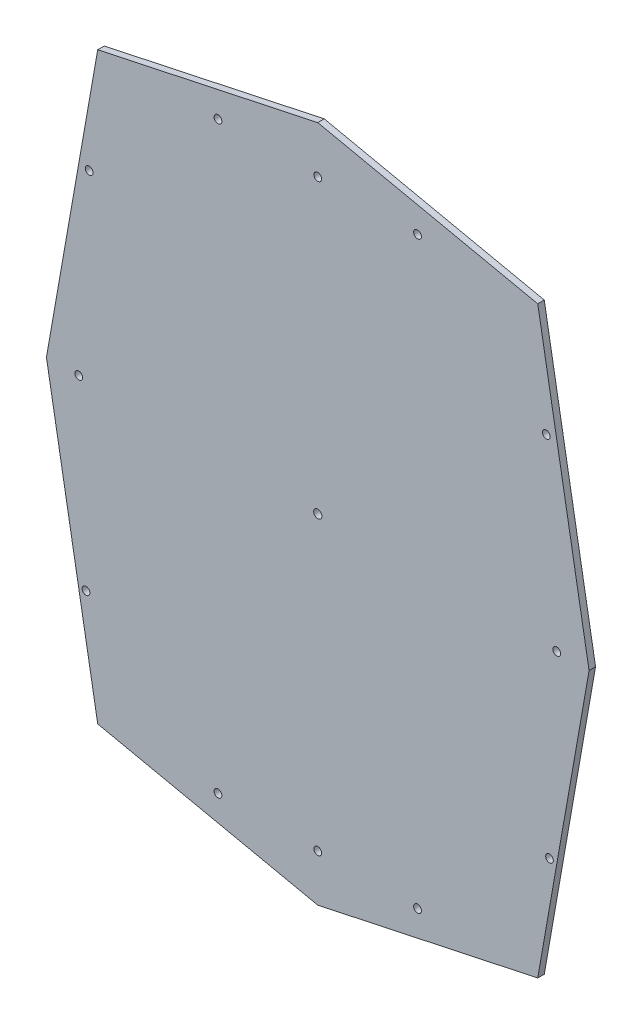
ISO-10303-21;
HEADER;
FILE_DESCRIPTION(('STEP AP214'),'2;1');
FILE_NAME('part.step','',(''),(''),'','','');
FILE_SCHEMA(('AUTOMOTIVE_DESIGN { 1 0 10303 214 1 1 1 1 }'));
ENDSEC;
DATA;
#1=APPLICATION_CONTEXT('core data for automotive mechanical design processes');
#2=APPLICATION_PROTOCOL_DEFINITION('international standard','automotive_design',2000,#1);
#3=PRODUCT_CONTEXT('',#1,'mechanical');
#4=PRODUCT('Part','Part','',(#3));
#5=PRODUCT_RELATED_PRODUCT_CATEGORY('part','',(#4));
#6=PRODUCT_DEFINITION_FORMATION('','',#4);
#7=PRODUCT_DEFINITION_CONTEXT('part definition',#1,'design');
#8=PRODUCT_DEFINITION('design','',#6,#7);
#9=PRODUCT_DEFINITION_SHAPE('','',#8);
#10=(LENGTH_UNIT() NAMED_UNIT(*) SI_UNIT(.MILLI.,.METRE.));
#11=(NAMED_UNIT(*) PLANE_ANGLE_UNIT() SI_UNIT($,.RADIAN.));
#12=(NAMED_UNIT(*) SI_UNIT($,.STERADIAN.) SOLID_ANGLE_UNIT());
#13=UNCERTAINTY_MEASURE_WITH_UNIT(LENGTH_MEASURE(1.E-05),#10,'distance_accuracy_value','');
#14=(GEOMETRIC_REPRESENTATION_CONTEXT(3) GLOBAL_UNCERTAINTY_ASSIGNED_CONTEXT((#13)) GLOBAL_UNIT_ASSIGNED_CONTEXT((#10,
#11,#12)) REPRESENTATION_CONTEXT('',''));
#15=CARTESIAN_POINT('',(0.,0.,0.));
#16=DIRECTION('',(0.,0.,1.));
#17=DIRECTION('',(1.,0.,0.));
#18=AXIS2_PLACEMENT_3D('',#15,#16,#17);
#19=CARTESIAN_POINT('',(0.,0.,-614.685281702783));
#20=DIRECTION('',(0.,0.,-1.));
#21=DIRECTION('',(-1.,0.,0.));
#22=AXIS2_PLACEMENT_3D('',#19,#20,#21);
#23=PLANE('',#22);
#24=DIRECTION('',(0.173058575308466,-0.984911533850733,0.));
#25=VECTOR('',#24,1.);
#26=CARTESIAN_POINT('',(-107.5,-142.639876692192,-614.685281702783));
#27=LINE('',#26,#25);
#28=CARTESIAN_POINT('',(-132.563219379729,0.,-614.685281702783));
#29=VERTEX_POINT('',#28);
#30=CARTESIAN_POINT('',(-107.5,-142.639876692192,-614.685281702783));
#31=VERTEX_POINT('',#30);
#32=EDGE_CURVE('E147',#29,#31,#27,.T.);
#33=ORIENTED_EDGE('',*,*,#32,.T.);
#34=DIRECTION('',(0.977998909393601,-0.208610002696245,0.));
#35=VECTOR('',#34,1.);
#36=CARTESIAN_POINT('',(-107.5,-142.639876692192,-614.685281702783));
#37=LINE('',#36,#35);
#38=CARTESIAN_POINT('',(0.,-165.569938346096,-614.685281702783));
#39=VERTEX_POINT('',#38);
#40=EDGE_CURVE('E95',#31,#39,#37,.T.);
#41=ORIENTED_EDGE('',*,*,#40,.T.);
#42=DIRECTION('',(0.977998909393601,0.208610002696245,0.));
#43=VECTOR('',#42,1.);
#44=CARTESIAN_POINT('',(0.,-165.569938346096,-614.685281702783));
#45=LINE('',#44,#43);
#46=CARTESIAN_POINT('',(107.5,-142.639876692192,-614.685281702783));
#47=VERTEX_POINT('',#46);
#48=EDGE_CURVE('E162',#39,#47,#45,.T.);
#49=ORIENTED_EDGE('',*,*,#48,.T.);
#50=DIRECTION('',(0.173058575308466,0.984911533850733,0.));
#51=VECTOR('',#50,1.);
#52=CARTESIAN_POINT('',(107.5,-142.639876692192,-614.685281702783));
#53=LINE('',#52,#51);
#54=CARTESIAN_POINT('',(132.563219379729,0.,-614.685281702783));
#55=VERTEX_POINT('',#54);
#56=EDGE_CURVE('E175',#47,#55,#53,.T.);
#57=ORIENTED_EDGE('',*,*,#56,.T.);
#58=DIRECTION('',(-0.173058575308466,0.984911533850733,0.));
#59=VECTOR('',#58,1.);
#60=CARTESIAN_POINT('',(107.5,142.639876692192,-614.685281702783));
#61=LINE('',#60,#59);
#62=CARTESIAN_POINT('',(107.5,142.639876692192,-614.685281702783));
#63=VERTEX_POINT('',#62);
#64=EDGE_CURVE('E114',#55,#63,#61,.T.);
#65=ORIENTED_EDGE('',*,*,#64,.T.);
#66=DIRECTION('',(-0.977998909393601,0.208610002696245,0.));
#67=VECTOR('',#66,1.);
#68=CARTESIAN_POINT('',(0.,165.569938346096,-614.685281702783));
#69=LINE('',#68,#67);
#70=CARTESIAN_POINT('',(0.,165.569938346096,-614.685281702783));
#71=VERTEX_POINT('',#70);
#72=EDGE_CURVE('E108',#63,#71,#69,.T.);
#73=ORIENTED_EDGE('',*,*,#72,.T.);
#74=DIRECTION('',(-0.977998909393601,-0.208610002696245,0.));
#75=VECTOR('',#74,1.);
#76=CARTESIAN_POINT('',(-107.5,142.639876692192,-614.685281702783));
#77=LINE('',#76,#75);
#78=CARTESIAN_POINT('',(-107.5,142.639876692192,-614.685281702783));
#79=VERTEX_POINT('',#78);
#80=EDGE_CURVE('E112',#71,#79,#77,.T.);
#81=ORIENTED_EDGE('',*,*,#80,.T.);
#82=DIRECTION('',(-0.173058575308466,-0.984911533850733,0.));
#83=VECTOR('',#82,1.);
#84=CARTESIAN_POINT('',(-107.5,142.639876692192,-614.685281702783));
#85=LINE('',#84,#83);
#86=EDGE_CURVE('E52',#79,#29,#85,.T.);
#87=ORIENTED_EDGE('',*,*,#86,.T.);
#88=EDGE_LOOP('',(#33,#41,#49,#57,#65,#73,#81,#87));
#89=FACE_BOUND('',#88,.T.);
#90=CARTESIAN_POINT('',(111.690160304498,89.4108355277152,-614.685281702783));
#91=DIRECTION('',(0.,0.,1.));
#92=DIRECTION('',(1.,0.,0.));
#93=AXIS2_PLACEMENT_3D('',#90,#91,#92);
#94=CIRCLE('',#93,1.89865000000001);
#95=CARTESIAN_POINT('',(113.588810304498,89.4108355277152,-614.685281702783));
#96=VERTEX_POINT('',#95);
#97=EDGE_CURVE('E136',#96,#96,#94,.T.);
#98=ORIENTED_EDGE('',*,*,#97,.F.);
#99=EDGE_LOOP('',(#98));
#100=FACE_BOUND('',#99,.T.);
#101=CARTESIAN_POINT('',(116.750007419271,0.165666821192728,-614.685281702783));
#102=DIRECTION('',(0.,0.,1.));
#103=DIRECTION('',(1.,0.,0.));
#104=AXIS2_PLACEMENT_3D('',#101,#102,#103);
#105=CIRCLE('',#104,1.89864999999999);
#106=CARTESIAN_POINT('',(118.648657419271,0.165666821192728,-614.685281702783));
#107=VERTEX_POINT('',#106);
#108=EDGE_CURVE('E184',#107,#107,#105,.T.);
#109=ORIENTED_EDGE('',*,*,#108,.F.);
#110=EDGE_LOOP('',(#109));
#111=FACE_BOUND('',#110,.T.);
#112=CARTESIAN_POINT('',(113.226895498003,-89.1533673914026,-614.685281702783));
#113=DIRECTION('',(0.,0.,1.));
#114=DIRECTION('',(1.,0.,0.));
#115=AXIS2_PLACEMENT_3D('',#112,#113,#114);
#116=CIRCLE('',#115,1.86918585137019);
#117=CARTESIAN_POINT('',(115.096081349373,-89.1533673914026,-614.685281702783));
#118=VERTEX_POINT('',#117);
#119=EDGE_CURVE('E190',#118,#118,#116,.T.);
#120=ORIENTED_EDGE('',*,*,#119,.F.);
#121=EDGE_LOOP('',(#120));
#122=FACE_BOUND('',#121,.T.);
#123=CARTESIAN_POINT('',(48.75,142.639876692192,-614.685281702783));
#124=DIRECTION('',(0.,0.,1.));
#125=DIRECTION('',(1.,0.,0.));
#126=AXIS2_PLACEMENT_3D('',#123,#124,#125);
#127=CIRCLE('',#126,1.89865);
#128=CARTESIAN_POINT('',(50.64865,142.639876692192,-614.685281702783));
#129=VERTEX_POINT('',#128);
#130=EDGE_CURVE('E196',#129,#129,#127,.T.);
#131=ORIENTED_EDGE('',*,*,#130,.F.);
#132=EDGE_LOOP('',(#131));
#133=FACE_BOUND('',#132,.T.);
#134=CARTESIAN_POINT('',(0.,142.639876692192,-614.685281702783));
#135=DIRECTION('',(0.,0.,1.));
#136=DIRECTION('',(1.,0.,0.));
#137=AXIS2_PLACEMENT_3D('',#134,#135,#136);
#138=CIRCLE('',#137,1.89865);
#139=CARTESIAN_POINT('',(1.89865,142.639876692192,-614.685281702783));
#140=VERTEX_POINT('',#139);
#141=EDGE_CURVE('E202',#140,#140,#138,.T.);
#142=ORIENTED_EDGE('',*,*,#141,.F.);
#143=EDGE_LOOP('',(#142));
#144=FACE_BOUND('',#143,.T.);
#145=CARTESIAN_POINT('',(-48.75,142.639876692192,-614.685281702783));
#146=DIRECTION('',(0.,0.,1.));
#147=DIRECTION('',(1.,0.,0.));
#148=AXIS2_PLACEMENT_3D('',#145,#146,#147);
#149=CIRCLE('',#148,1.89865);
#150=CARTESIAN_POINT('',(-46.85135,142.639876692192,-614.685281702783));
#151=VERTEX_POINT('',#150);
#152=EDGE_CURVE('E208',#151,#151,#149,.T.);
#153=ORIENTED_EDGE('',*,*,#152,.F.);
#154=EDGE_LOOP('',(#153));
#155=FACE_BOUND('',#154,.T.);
#156=CARTESIAN_POINT('',(48.75,-142.639876692192,-614.685281702783));
#157=DIRECTION('',(0.,0.,1.));
#158=DIRECTION('',(1.,0.,0.));
#159=AXIS2_PLACEMENT_3D('',#156,#157,#158);
#160=CIRCLE('',#159,1.89865);
#161=CARTESIAN_POINT('',(50.64865,-142.639876692192,-614.685281702783));
#162=VERTEX_POINT('',#161);
#163=EDGE_CURVE('E214',#162,#162,#160,.T.);
#164=ORIENTED_EDGE('',*,*,#163,.F.);
#165=EDGE_LOOP('',(#164));
#166=FACE_BOUND('',#165,.T.);
#167=CARTESIAN_POINT('',(0.,-142.639876692192,-614.685281702783));
#168=DIRECTION('',(0.,0.,1.));
#169=DIRECTION('',(1.,0.,0.));
#170=AXIS2_PLACEMENT_3D('',#167,#168,#169);
#171=CIRCLE('',#170,1.89865);
#172=CARTESIAN_POINT('',(1.89865,-142.639876692192,-614.685281702783));
#173=VERTEX_POINT('',#172);
#174=EDGE_CURVE('E220',#173,#173,#171,.T.);
#175=ORIENTED_EDGE('',*,*,#174,.F.);
#176=EDGE_LOOP('',(#175));
#177=FACE_BOUND('',#176,.T.);
#178=CARTESIAN_POINT('',(-48.75,-142.639876692192,-614.685281702783));
#179=DIRECTION('',(0.,0.,1.));
#180=DIRECTION('',(1.,0.,0.));
#181=AXIS2_PLACEMENT_3D('',#178,#179,#180);
#182=CIRCLE('',#181,1.89865);
#183=CARTESIAN_POINT('',(-46.85135,-142.639876692192,-614.685281702783));
#184=VERTEX_POINT('',#183);
#185=EDGE_CURVE('E226',#184,#184,#182,.T.);
#186=ORIENTED_EDGE('',*,*,#185,.F.);
#187=EDGE_LOOP('',(#186));
#188=FACE_BOUND('',#187,.T.);
#189=CARTESIAN_POINT('',(-113.226895498003,-89.1533673914026,-614.685281702783));
#190=DIRECTION('',(0.,0.,1.));
#191=DIRECTION('',(1.,0.,0.));
#192=AXIS2_PLACEMENT_3D('',#189,#190,#191);
#193=CIRCLE('',#192,1.89865000000001);
#194=CARTESIAN_POINT('',(-111.328245498003,-89.1533673914026,-614.685281702783));
#195=VERTEX_POINT('',#194);
#196=EDGE_CURVE('E232',#195,#195,#193,.T.);
#197=ORIENTED_EDGE('',*,*,#196,.F.);
#198=EDGE_LOOP('',(#197));
#199=FACE_BOUND('',#198,.T.);
#200=CARTESIAN_POINT('',(-116.750007419271,0.165666821192728,-614.685281702783));
#201=DIRECTION('',(0.,0.,1.));
#202=DIRECTION('',(1.,0.,0.));
#203=AXIS2_PLACEMENT_3D('',#200,#201,#202);
#204=CIRCLE('',#203,1.89865000000001);
#205=CARTESIAN_POINT('',(-114.851357419271,0.165666821192728,-614.685281702783));
#206=VERTEX_POINT('',#205);
#207=EDGE_CURVE('E238',#206,#206,#204,.T.);
#208=ORIENTED_EDGE('',*,*,#207,.F.);
#209=EDGE_LOOP('',(#208));
#210=FACE_BOUND('',#209,.T.);
#211=CARTESIAN_POINT('',(-111.690160304498,89.4108355277152,-614.685281702783));
#212=DIRECTION('',(0.,0.,1.));
#213=DIRECTION('',(1.,0.,0.));
#214=AXIS2_PLACEMENT_3D('',#211,#212,#213);
#215=CIRCLE('',#214,1.89865000000001);
#216=CARTESIAN_POINT('',(-109.791510304498,89.4108355277152,-614.685281702783));
#217=VERTEX_POINT('',#216);
#218=EDGE_CURVE('E244',#217,#217,#215,.T.);
#219=ORIENTED_EDGE('',*,*,#218,.F.);
#220=EDGE_LOOP('',(#219));
#221=FACE_BOUND('',#220,.T.);
#222=CARTESIAN_POINT('',(0.,0.,-614.685281702783));
#223=DIRECTION('',(0.,0.,1.));
#224=DIRECTION('',(1.,0.,0.));
#225=AXIS2_PLACEMENT_3D('',#222,#223,#224);
#226=CIRCLE('',#225,2.0193);
#227=CARTESIAN_POINT('',(2.0193,0.,-614.685281702783));
#228=VERTEX_POINT('',#227);
#229=EDGE_CURVE('E255',#228,#228,#226,.T.);
#230=ORIENTED_EDGE('',*,*,#229,.F.);
#231=EDGE_LOOP('',(#230));
#232=FACE_BOUND('',#231,.T.);
#233=ADVANCED_FACE('F35',(#89,#100,#111,#122,#133,#144,#155,#166,#177,#188,#199,#210,#221,#232),
#23,.F.);
#234=CARTESIAN_POINT('',(0.,0.,-617.860281702783));
#235=DIRECTION('',(0.,0.,-1.));
#236=DIRECTION('',(-1.,0.,0.));
#237=AXIS2_PLACEMENT_3D('',#234,#235,#236);
#238=PLANE('',#237);
#239=CARTESIAN_POINT('',(0.,0.,-617.860281702783));
#240=DIRECTION('',(0.,0.,-1.));
#241=DIRECTION('',(-1.,0.,0.));
#242=AXIS2_PLACEMENT_3D('',#239,#240,#241);
#243=CIRCLE('',#242,2.0193);
#244=CARTESIAN_POINT('',(-2.0193,0.,-617.860281702783));
#245=VERTEX_POINT('',#244);
#246=EDGE_CURVE('E250',#245,#245,#243,.T.);
#247=ORIENTED_EDGE('',*,*,#246,.F.);
#248=EDGE_LOOP('',(#247));
#249=FACE_BOUND('',#248,.T.);
#250=CARTESIAN_POINT('',(-116.750007419271,0.165666821192728,-617.860281702783));
#251=DIRECTION('',(0.,0.,1.));
#252=DIRECTION('',(1.,0.,0.));
#253=AXIS2_PLACEMENT_3D('',#250,#251,#252);
#254=CIRCLE('',#253,1.89865000000001);
#255=CARTESIAN_POINT('',(-114.851357419271,0.165666821192728,-617.860281702783));
#256=VERTEX_POINT('',#255);
#257=EDGE_CURVE('E241',#256,#256,#254,.T.);
#258=ORIENTED_EDGE('',*,*,#257,.T.);
#259=EDGE_LOOP('',(#258));
#260=FACE_BOUND('',#259,.T.);
#261=CARTESIAN_POINT('',(-48.75,-142.639876692192,-617.860281702783));
#262=DIRECTION('',(0.,0.,1.));
#263=DIRECTION('',(1.,0.,0.));
#264=AXIS2_PLACEMENT_3D('',#261,#262,#263);
#265=CIRCLE('',#264,1.89865);
#266=CARTESIAN_POINT('',(-46.85135,-142.639876692192,-617.860281702783));
#267=VERTEX_POINT('',#266);
#268=EDGE_CURVE('E229',#267,#267,#265,.T.);
#269=ORIENTED_EDGE('',*,*,#268,.T.);
#270=EDGE_LOOP('',(#269));
#271=FACE_BOUND('',#270,.T.);
#272=CARTESIAN_POINT('',(48.75,-142.639876692192,-617.860281702783));
#273=DIRECTION('',(0.,0.,1.));
#274=DIRECTION('',(1.,0.,0.));
#275=AXIS2_PLACEMENT_3D('',#272,#273,#274);
#276=CIRCLE('',#275,1.89865);
#277=CARTESIAN_POINT('',(50.64865,-142.639876692192,-617.860281702783));
#278=VERTEX_POINT('',#277);
#279=EDGE_CURVE('E217',#278,#278,#276,.T.);
#280=ORIENTED_EDGE('',*,*,#279,.T.);
#281=EDGE_LOOP('',(#280));
#282=FACE_BOUND('',#281,.T.);
#283=CARTESIAN_POINT('',(0.,142.639876692192,-617.860281702783));
#284=DIRECTION('',(0.,0.,1.));
#285=DIRECTION('',(1.,0.,0.));
#286=AXIS2_PLACEMENT_3D('',#283,#284,#285);
#287=CIRCLE('',#286,1.89865);
#288=CARTESIAN_POINT('',(1.89865,142.639876692192,-617.860281702783));
#289=VERTEX_POINT('',#288);
#290=EDGE_CURVE('E205',#289,#289,#287,.T.);
#291=ORIENTED_EDGE('',*,*,#290,.T.);
#292=EDGE_LOOP('',(#291));
#293=FACE_BOUND('',#292,.T.);
#294=CARTESIAN_POINT('',(113.226895498003,-89.1533673914026,-617.860281702783));
#295=DIRECTION('',(0.,0.,1.));
#296=DIRECTION('',(1.,0.,0.));
#297=AXIS2_PLACEMENT_3D('',#294,#295,#296);
#298=CIRCLE('',#297,1.86918585137019);
#299=CARTESIAN_POINT('',(115.096081349373,-89.1533673914026,-617.860281702783));
#300=VERTEX_POINT('',#299);
#301=EDGE_CURVE('E193',#300,#300,#298,.T.);
#302=ORIENTED_EDGE('',*,*,#301,.T.);
#303=EDGE_LOOP('',(#302));
#304=FACE_BOUND('',#303,.T.);
#305=CARTESIAN_POINT('',(111.690160304498,89.4108355277152,-617.860281702783));
#306=DIRECTION('',(0.,0.,1.));
#307=DIRECTION('',(1.,0.,0.));
#308=AXIS2_PLACEMENT_3D('',#305,#306,#307);
#309=CIRCLE('',#308,1.89865000000001);
#310=CARTESIAN_POINT('',(113.588810304498,89.4108355277152,-617.860281702783));
#311=VERTEX_POINT('',#310);
#312=EDGE_CURVE('E181',#311,#311,#309,.T.);
#313=ORIENTED_EDGE('',*,*,#312,.T.);
#314=EDGE_LOOP('',(#313));
#315=FACE_BOUND('',#314,.T.);
#316=DIRECTION('',(0.173058575308466,-0.984911533850733,0.));
#317=VECTOR('',#316,1.);
#318=CARTESIAN_POINT('',(-107.5,-142.639876692192,-617.860281702783));
#319=LINE('',#318,#317);
#320=CARTESIAN_POINT('',(-132.563219379729,0.,-617.860281702783));
#321=VERTEX_POINT('',#320);
#322=CARTESIAN_POINT('',(-107.5,-142.639876692192,-617.860281702783));
#323=VERTEX_POINT('',#322);
#324=EDGE_CURVE('E132',#321,#323,#319,.T.);
#325=ORIENTED_EDGE('',*,*,#324,.F.);
#326=DIRECTION('',(-0.173058575308466,-0.984911533850733,0.));
#327=VECTOR('',#326,1.);
#328=CARTESIAN_POINT('',(-107.5,142.639876692192,-617.860281702783));
#329=LINE('',#328,#327);
#330=CARTESIAN_POINT('',(-107.5,142.639876692192,-617.860281702783));
#331=VERTEX_POINT('',#330);
#332=EDGE_CURVE('E87',#331,#321,#329,.T.);
#333=ORIENTED_EDGE('',*,*,#332,.F.);
#334=DIRECTION('',(-0.977998909393601,-0.208610002696245,0.));
#335=VECTOR('',#334,1.);
#336=CARTESIAN_POINT('',(-107.5,142.639876692192,-617.860281702783));
#337=LINE('',#336,#335);
#338=CARTESIAN_POINT('',(0.,165.569938346096,-617.860281702783));
#339=VERTEX_POINT('',#338);
#340=EDGE_CURVE('E81',#339,#331,#337,.T.);
#341=ORIENTED_EDGE('',*,*,#340,.F.);
#342=DIRECTION('',(-0.977998909393601,0.208610002696245,0.));
#343=VECTOR('',#342,1.);
#344=CARTESIAN_POINT('',(0.,165.569938346096,-617.860281702783));
#345=LINE('',#344,#343);
#346=CARTESIAN_POINT('',(107.5,142.639876692192,-617.860281702783));
#347=VERTEX_POINT('',#346);
#348=EDGE_CURVE('E122',#347,#339,#345,.T.);
#349=ORIENTED_EDGE('',*,*,#348,.F.);
#350=DIRECTION('',(-0.173058575308466,0.984911533850733,0.));
#351=VECTOR('',#350,1.);
#352=CARTESIAN_POINT('',(107.5,142.639876692192,-617.860281702783));
#353=LINE('',#352,#351);
#354=CARTESIAN_POINT('',(132.563219379729,0.,-617.860281702783));
#355=VERTEX_POINT('',#354);
#356=EDGE_CURVE('E142',#355,#347,#353,.T.);
#357=ORIENTED_EDGE('',*,*,#356,.F.);
#358=DIRECTION('',(0.173058575308466,0.984911533850733,0.));
#359=VECTOR('',#358,1.);
#360=CARTESIAN_POINT('',(107.5,-142.639876692192,-617.860281702783));
#361=LINE('',#360,#359);
#362=CARTESIAN_POINT('',(107.5,-142.639876692192,-617.860281702783));
#363=VERTEX_POINT('',#362);
#364=EDGE_CURVE('E140',#363,#355,#361,.T.);
#365=ORIENTED_EDGE('',*,*,#364,.F.);
#366=DIRECTION('',(0.977998909393601,0.208610002696245,0.));
#367=VECTOR('',#366,1.);
#368=CARTESIAN_POINT('',(0.,-165.569938346096,-617.860281702783));
#369=LINE('',#368,#367);
#370=CARTESIAN_POINT('',(0.,-165.569938346096,-617.860281702783));
#371=VERTEX_POINT('',#370);
#372=EDGE_CURVE('E138',#371,#363,#369,.T.);
#373=ORIENTED_EDGE('',*,*,#372,.F.);
#374=DIRECTION('',(0.977998909393601,-0.208610002696245,0.));
#375=VECTOR('',#374,1.);
#376=CARTESIAN_POINT('',(-107.5,-142.639876692192,-617.860281702783));
#377=LINE('',#376,#375);
#378=EDGE_CURVE('E135',#323,#371,#377,.T.);
#379=ORIENTED_EDGE('',*,*,#378,.F.);
#380=EDGE_LOOP('',(#325,#333,#341,#349,#357,#365,#373,#379));
#381=FACE_BOUND('',#380,.T.);
#382=CARTESIAN_POINT('',(116.750007419271,0.165666821192728,-617.860281702783));
#383=DIRECTION('',(0.,0.,1.));
#384=DIRECTION('',(1.,0.,0.));
#385=AXIS2_PLACEMENT_3D('',#382,#383,#384);
#386=CIRCLE('',#385,1.89864999999999);
#387=CARTESIAN_POINT('',(118.648657419271,0.165666821192728,-617.860281702783));
#388=VERTEX_POINT('',#387);
#389=EDGE_CURVE('E187',#388,#388,#386,.T.);
#390=ORIENTED_EDGE('',*,*,#389,.T.);
#391=EDGE_LOOP('',(#390));
#392=FACE_BOUND('',#391,.T.);
#393=CARTESIAN_POINT('',(48.75,142.639876692192,-617.860281702783));
#394=DIRECTION('',(0.,0.,1.));
#395=DIRECTION('',(1.,0.,0.));
#396=AXIS2_PLACEMENT_3D('',#393,#394,#395);
#397=CIRCLE('',#396,1.89865);
#398=CARTESIAN_POINT('',(50.64865,142.639876692192,-617.860281702783));
#399=VERTEX_POINT('',#398);
#400=EDGE_CURVE('E199',#399,#399,#397,.T.);
#401=ORIENTED_EDGE('',*,*,#400,.T.);
#402=EDGE_LOOP('',(#401));
#403=FACE_BOUND('',#402,.T.);
#404=CARTESIAN_POINT('',(-48.75,142.639876692192,-617.860281702783));
#405=DIRECTION('',(0.,0.,1.));
#406=DIRECTION('',(1.,0.,0.));
#407=AXIS2_PLACEMENT_3D('',#404,#405,#406);
#408=CIRCLE('',#407,1.89865);
#409=CARTESIAN_POINT('',(-46.85135,142.639876692192,-617.860281702783));
#410=VERTEX_POINT('',#409);
#411=EDGE_CURVE('E211',#410,#410,#408,.T.);
#412=ORIENTED_EDGE('',*,*,#411,.T.);
#413=EDGE_LOOP('',(#412));
#414=FACE_BOUND('',#413,.T.);
#415=CARTESIAN_POINT('',(0.,-142.639876692192,-617.860281702783));
#416=DIRECTION('',(0.,0.,1.));
#417=DIRECTION('',(1.,0.,0.));
#418=AXIS2_PLACEMENT_3D('',#415,#416,#417);
#419=CIRCLE('',#418,1.89865);
#420=CARTESIAN_POINT('',(1.89865,-142.639876692192,-617.860281702783));
#421=VERTEX_POINT('',#420);
#422=EDGE_CURVE('E223',#421,#421,#419,.T.);
#423=ORIENTED_EDGE('',*,*,#422,.T.);
#424=EDGE_LOOP('',(#423));
#425=FACE_BOUND('',#424,.T.);
#426=CARTESIAN_POINT('',(-113.226895498003,-89.1533673914026,-617.860281702783));
#427=DIRECTION('',(0.,0.,1.));
#428=DIRECTION('',(1.,0.,0.));
#429=AXIS2_PLACEMENT_3D('',#426,#427,#428);
#430=CIRCLE('',#429,1.89865000000001);
#431=CARTESIAN_POINT('',(-111.328245498003,-89.1533673914026,-617.860281702783));
#432=VERTEX_POINT('',#431);
#433=EDGE_CURVE('E235',#432,#432,#430,.T.);
#434=ORIENTED_EDGE('',*,*,#433,.T.);
#435=EDGE_LOOP('',(#434));
#436=FACE_BOUND('',#435,.T.);
#437=CARTESIAN_POINT('',(-111.690160304498,89.4108355277152,-617.860281702783));
#438=DIRECTION('',(0.,0.,1.));
#439=DIRECTION('',(1.,0.,0.));
#440=AXIS2_PLACEMENT_3D('',#437,#438,#439);
#441=CIRCLE('',#440,1.89865000000001);
#442=CARTESIAN_POINT('',(-109.791510304498,89.4108355277152,-617.860281702783));
#443=VERTEX_POINT('',#442);
#444=EDGE_CURVE('E247',#443,#443,#441,.T.);
#445=ORIENTED_EDGE('',*,*,#444,.T.);
#446=EDGE_LOOP('',(#445));
#447=FACE_BOUND('',#446,.T.);
#448=ADVANCED_FACE('F166',(#249,#260,#271,#282,#293,#304,#315,#381,#392,#403,#414,#425,#436,
#447),#238,.T.);
#449=CARTESIAN_POINT('',(-107.5,-142.639876692192,-614.685281702783));
#450=DIRECTION('',(0.984911533850733,0.173058575308466,0.));
#451=DIRECTION('',(-0.173058575308466,0.984911533850733,0.));
#452=AXIS2_PLACEMENT_3D('',#449,#450,#451);
#453=PLANE('',#452);
#454=ORIENTED_EDGE('',*,*,#324,.T.);
#455=DIRECTION('',(0.,0.,-1.));
#456=VECTOR('',#455,1.);
#457=CARTESIAN_POINT('',(-107.5,-142.639876692192,-614.685281702783));
#458=LINE('',#457,#456);
#459=EDGE_CURVE('E11',#31,#323,#458,.T.);
#460=ORIENTED_EDGE('',*,*,#459,.F.);
#461=ORIENTED_EDGE('',*,*,#32,.F.);
#462=DIRECTION('',(0.,0.,-1.));
#463=VECTOR('',#462,1.);
#464=CARTESIAN_POINT('',(-132.563219379729,0.,-614.685281702783));
#465=LINE('',#464,#463);
#466=EDGE_CURVE('E128',#29,#321,#465,.T.);
#467=ORIENTED_EDGE('',*,*,#466,.T.);
#468=EDGE_LOOP('',(#454,#460,#461,#467));
#469=FACE_BOUND('',#468,.T.);
#470=ADVANCED_FACE('F37',(#469),#453,.F.);
#471=CARTESIAN_POINT('',(-107.5,-142.639876692192,-614.685281702783));
#472=DIRECTION('',(0.208610002696245,0.977998909393601,0.));
#473=DIRECTION('',(-0.977998909393601,0.208610002696245,0.));
#474=AXIS2_PLACEMENT_3D('',#471,#472,#473);
#475=PLANE('',#474);
#476=ORIENTED_EDGE('',*,*,#378,.T.);
#477=DIRECTION('',(0.,0.,-1.));
#478=VECTOR('',#477,1.);
#479=CARTESIAN_POINT('',(0.,-165.569938346096,-614.685281702783));
#480=LINE('',#479,#478);
#481=EDGE_CURVE('E44',#39,#371,#480,.T.);
#482=ORIENTED_EDGE('',*,*,#481,.F.);
#483=ORIENTED_EDGE('',*,*,#40,.F.);
#484=ORIENTED_EDGE('',*,*,#459,.T.);
#485=EDGE_LOOP('',(#476,#482,#483,#484));
#486=FACE_BOUND('',#485,.T.);
#487=ADVANCED_FACE('F285',(#486),#475,.F.);
#488=CARTESIAN_POINT('',(0.,-165.569938346096,-614.685281702783));
#489=DIRECTION('',(-0.208610002696245,0.977998909393601,0.));
#490=DIRECTION('',(-0.977998909393601,-0.208610002696245,0.));
#491=AXIS2_PLACEMENT_3D('',#488,#489,#490);
#492=PLANE('',#491);
#493=ORIENTED_EDGE('',*,*,#372,.T.);
#494=DIRECTION('',(0.,0.,-1.));
#495=VECTOR('',#494,1.);
#496=CARTESIAN_POINT('',(107.5,-142.639876692192,-614.685281702783));
#497=LINE('',#496,#495);
#498=EDGE_CURVE('E154',#47,#363,#497,.T.);
#499=ORIENTED_EDGE('',*,*,#498,.F.);
#500=ORIENTED_EDGE('',*,*,#48,.F.);
#501=ORIENTED_EDGE('',*,*,#481,.T.);
#502=EDGE_LOOP('',(#493,#499,#500,#501));
#503=FACE_BOUND('',#502,.T.);
#504=ADVANCED_FACE('F160',(#503),#492,.F.);
#505=CARTESIAN_POINT('',(107.5,-142.639876692192,-614.685281702783));
#506=DIRECTION('',(-0.984911533850733,0.173058575308466,0.));
#507=DIRECTION('',(-0.173058575308466,-0.984911533850733,0.));
#508=AXIS2_PLACEMENT_3D('',#505,#506,#507);
#509=PLANE('',#508);
#510=ORIENTED_EDGE('',*,*,#364,.T.);
#511=DIRECTION('',(0.,0.,-1.));
#512=VECTOR('',#511,1.);
#513=CARTESIAN_POINT('',(132.563219379729,0.,-614.685281702783));
#514=LINE('',#513,#512);
#515=EDGE_CURVE('E151',#55,#355,#514,.T.);
#516=ORIENTED_EDGE('',*,*,#515,.F.);
#517=ORIENTED_EDGE('',*,*,#56,.F.);
#518=ORIENTED_EDGE('',*,*,#498,.T.);
#519=EDGE_LOOP('',(#510,#516,#517,#518));
#520=FACE_BOUND('',#519,.T.);
#521=ADVANCED_FACE('F171',(#520),#509,.F.);
#522=CARTESIAN_POINT('',(107.5,142.639876692192,-614.685281702783));
#523=DIRECTION('',(-0.984911533850733,-0.173058575308466,0.));
#524=DIRECTION('',(0.173058575308466,-0.984911533850733,0.));
#525=AXIS2_PLACEMENT_3D('',#522,#523,#524);
#526=PLANE('',#525);
#527=ORIENTED_EDGE('',*,*,#356,.T.);
#528=DIRECTION('',(0.,0.,-1.));
#529=VECTOR('',#528,1.);
#530=CARTESIAN_POINT('',(107.5,142.639876692192,-614.685281702783));
#531=LINE('',#530,#529);
#532=EDGE_CURVE('E123',#63,#347,#531,.T.);
#533=ORIENTED_EDGE('',*,*,#532,.F.);
#534=ORIENTED_EDGE('',*,*,#64,.F.);
#535=ORIENTED_EDGE('',*,*,#515,.T.);
#536=EDGE_LOOP('',(#527,#533,#534,#535));
#537=FACE_BOUND('',#536,.T.);
#538=ADVANCED_FACE('F174',(#537),#526,.F.);
#539=CARTESIAN_POINT('',(0.,165.569938346096,-614.685281702783));
#540=DIRECTION('',(-0.208610002696245,-0.977998909393601,0.));
#541=DIRECTION('',(0.977998909393601,-0.208610002696245,0.));
#542=AXIS2_PLACEMENT_3D('',#539,#540,#541);
#543=PLANE('',#542);
#544=ORIENTED_EDGE('',*,*,#348,.T.);
#545=DIRECTION('',(0.,0.,-1.));
#546=VECTOR('',#545,1.);
#547=CARTESIAN_POINT('',(0.,165.569938346096,-614.685281702783));
#548=LINE('',#547,#546);
#549=EDGE_CURVE('E119',#71,#339,#548,.T.);
#550=ORIENTED_EDGE('',*,*,#549,.F.);
#551=ORIENTED_EDGE('',*,*,#72,.F.);
#552=ORIENTED_EDGE('',*,*,#532,.T.);
#553=EDGE_LOOP('',(#544,#550,#551,#552));
#554=FACE_BOUND('',#553,.T.);
#555=ADVANCED_FACE('F120',(#554),#543,.F.);
#556=CARTESIAN_POINT('',(-107.5,142.639876692192,-614.685281702783));
#557=DIRECTION('',(0.208610002696245,-0.977998909393601,0.));
#558=DIRECTION('',(0.977998909393601,0.208610002696245,0.));
#559=AXIS2_PLACEMENT_3D('',#556,#557,#558);
#560=PLANE('',#559);
#561=ORIENTED_EDGE('',*,*,#340,.T.);
#562=DIRECTION('',(0.,0.,-1.));
#563=VECTOR('',#562,1.);
#564=CARTESIAN_POINT('',(-107.5,142.639876692192,-614.685281702783));
#565=LINE('',#564,#563);
#566=EDGE_CURVE('E124',#79,#331,#565,.T.);
#567=ORIENTED_EDGE('',*,*,#566,.F.);
#568=ORIENTED_EDGE('',*,*,#80,.F.);
#569=ORIENTED_EDGE('',*,*,#549,.T.);
#570=EDGE_LOOP('',(#561,#567,#568,#569));
#571=FACE_BOUND('',#570,.T.);
#572=ADVANCED_FACE('F126',(#571),#560,.F.);
#573=CARTESIAN_POINT('',(-107.5,142.639876692192,-614.685281702783));
#574=DIRECTION('',(0.984911533850733,-0.173058575308466,0.));
#575=DIRECTION('',(0.173058575308466,0.984911533850733,0.));
#576=AXIS2_PLACEMENT_3D('',#573,#574,#575);
#577=PLANE('',#576);
#578=ORIENTED_EDGE('',*,*,#332,.T.);
#579=ORIENTED_EDGE('',*,*,#466,.F.);
#580=ORIENTED_EDGE('',*,*,#86,.F.);
#581=ORIENTED_EDGE('',*,*,#566,.T.);
#582=EDGE_LOOP('',(#578,#579,#580,#581));
#583=FACE_BOUND('',#582,.T.);
#584=ADVANCED_FACE('F273',(#583),#577,.F.);
#585=CARTESIAN_POINT('',(111.690160304498,89.4108355277152,-614.685281702783));
#586=DIRECTION('',(0.,0.,-1.));
#587=DIRECTION('',(-1.,0.,0.));
#588=AXIS2_PLACEMENT_3D('',#585,#586,#587);
#589=CYLINDRICAL_SURFACE('',#588,1.89865000000001);
#590=ORIENTED_EDGE('',*,*,#97,.T.);
#591=EDGE_LOOP('',(#590));
#592=FACE_BOUND('',#591,.T.);
#593=ORIENTED_EDGE('',*,*,#312,.F.);
#594=EDGE_LOOP('',(#593));
#595=FACE_BOUND('',#594,.T.);
#596=ADVANCED_FACE('F270',(#592,#595),#589,.F.);
#597=CARTESIAN_POINT('',(116.750007419271,0.165666821192728,-614.685281702783));
#598=DIRECTION('',(0.,0.,-1.));
#599=DIRECTION('',(-1.,0.,0.));
#600=AXIS2_PLACEMENT_3D('',#597,#598,#599);
#601=CYLINDRICAL_SURFACE('',#600,1.89864999999999);
#602=ORIENTED_EDGE('',*,*,#108,.T.);
#603=EDGE_LOOP('',(#602));
#604=FACE_BOUND('',#603,.T.);
#605=ORIENTED_EDGE('',*,*,#389,.F.);
#606=EDGE_LOOP('',(#605));
#607=FACE_BOUND('',#606,.T.);
#608=ADVANCED_FACE('F392',(#604,#607),#601,.F.);
#609=CARTESIAN_POINT('',(113.226895498003,-89.1533673914026,-614.685281702783));
#610=DIRECTION('',(0.,0.,-1.));
#611=DIRECTION('',(-1.,0.,0.));
#612=AXIS2_PLACEMENT_3D('',#609,#610,#611);
#613=CYLINDRICAL_SURFACE('',#612,1.86918585137019);
#614=ORIENTED_EDGE('',*,*,#119,.T.);
#615=EDGE_LOOP('',(#614));
#616=FACE_BOUND('',#615,.T.);
#617=ORIENTED_EDGE('',*,*,#301,.F.);
#618=EDGE_LOOP('',(#617));
#619=FACE_BOUND('',#618,.T.);
#620=ADVANCED_FACE('F384',(#616,#619),#613,.F.);
#621=CARTESIAN_POINT('',(48.75,142.639876692192,-614.685281702783));
#622=DIRECTION('',(0.,0.,-1.));
#623=DIRECTION('',(-1.,0.,0.));
#624=AXIS2_PLACEMENT_3D('',#621,#622,#623);
#625=CYLINDRICAL_SURFACE('',#624,1.89865);
#626=ORIENTED_EDGE('',*,*,#130,.T.);
#627=EDGE_LOOP('',(#626));
#628=FACE_BOUND('',#627,.T.);
#629=ORIENTED_EDGE('',*,*,#400,.F.);
#630=EDGE_LOOP('',(#629));
#631=FACE_BOUND('',#630,.T.);
#632=ADVANCED_FACE('F376',(#628,#631),#625,.F.);
#633=CARTESIAN_POINT('',(0.,142.639876692192,-614.685281702783));
#634=DIRECTION('',(0.,0.,-1.));
#635=DIRECTION('',(-1.,0.,0.));
#636=AXIS2_PLACEMENT_3D('',#633,#634,#635);
#637=CYLINDRICAL_SURFACE('',#636,1.89865);
#638=ORIENTED_EDGE('',*,*,#141,.T.);
#639=EDGE_LOOP('',(#638));
#640=FACE_BOUND('',#639,.T.);
#641=ORIENTED_EDGE('',*,*,#290,.F.);
#642=EDGE_LOOP('',(#641));
#643=FACE_BOUND('',#642,.T.);
#644=ADVANCED_FACE('F368',(#640,#643),#637,.F.);
#645=CARTESIAN_POINT('',(-48.75,142.639876692192,-614.685281702783));
#646=DIRECTION('',(0.,0.,-1.));
#647=DIRECTION('',(-1.,0.,0.));
#648=AXIS2_PLACEMENT_3D('',#645,#646,#647);
#649=CYLINDRICAL_SURFACE('',#648,1.89865);
#650=ORIENTED_EDGE('',*,*,#152,.T.);
#651=EDGE_LOOP('',(#650));
#652=FACE_BOUND('',#651,.T.);
#653=ORIENTED_EDGE('',*,*,#411,.F.);
#654=EDGE_LOOP('',(#653));
#655=FACE_BOUND('',#654,.T.);
#656=ADVANCED_FACE('F360',(#652,#655),#649,.F.);
#657=CARTESIAN_POINT('',(48.75,-142.639876692192,-614.685281702783));
#658=DIRECTION('',(0.,0.,-1.));
#659=DIRECTION('',(-1.,0.,0.));
#660=AXIS2_PLACEMENT_3D('',#657,#658,#659);
#661=CYLINDRICAL_SURFACE('',#660,1.89865);
#662=ORIENTED_EDGE('',*,*,#163,.T.);
#663=EDGE_LOOP('',(#662));
#664=FACE_BOUND('',#663,.T.);
#665=ORIENTED_EDGE('',*,*,#279,.F.);
#666=EDGE_LOOP('',(#665));
#667=FACE_BOUND('',#666,.T.);
#668=ADVANCED_FACE('F352',(#664,#667),#661,.F.);
#669=CARTESIAN_POINT('',(0.,-142.639876692192,-614.685281702783));
#670=DIRECTION('',(0.,0.,-1.));
#671=DIRECTION('',(-1.,0.,0.));
#672=AXIS2_PLACEMENT_3D('',#669,#670,#671);
#673=CYLINDRICAL_SURFACE('',#672,1.89865);
#674=ORIENTED_EDGE('',*,*,#174,.T.);
#675=EDGE_LOOP('',(#674));
#676=FACE_BOUND('',#675,.T.);
#677=ORIENTED_EDGE('',*,*,#422,.F.);
#678=EDGE_LOOP('',(#677));
#679=FACE_BOUND('',#678,.T.);
#680=ADVANCED_FACE('F344',(#676,#679),#673,.F.);
#681=CARTESIAN_POINT('',(-48.75,-142.639876692192,-614.685281702783));
#682=DIRECTION('',(0.,0.,-1.));
#683=DIRECTION('',(-1.,0.,0.));
#684=AXIS2_PLACEMENT_3D('',#681,#682,#683);
#685=CYLINDRICAL_SURFACE('',#684,1.89865);
#686=ORIENTED_EDGE('',*,*,#185,.T.);
#687=EDGE_LOOP('',(#686));
#688=FACE_BOUND('',#687,.T.);
#689=ORIENTED_EDGE('',*,*,#268,.F.);
#690=EDGE_LOOP('',(#689));
#691=FACE_BOUND('',#690,.T.);
#692=ADVANCED_FACE('F336',(#688,#691),#685,.F.);
#693=CARTESIAN_POINT('',(-113.226895498003,-89.1533673914026,-614.685281702783));
#694=DIRECTION('',(0.,0.,-1.));
#695=DIRECTION('',(-1.,0.,0.));
#696=AXIS2_PLACEMENT_3D('',#693,#694,#695);
#697=CYLINDRICAL_SURFACE('',#696,1.89865000000001);
#698=ORIENTED_EDGE('',*,*,#196,.T.);
#699=EDGE_LOOP('',(#698));
#700=FACE_BOUND('',#699,.T.);
#701=ORIENTED_EDGE('',*,*,#433,.F.);
#702=EDGE_LOOP('',(#701));
#703=FACE_BOUND('',#702,.T.);
#704=ADVANCED_FACE('F328',(#700,#703),#697,.F.);
#705=CARTESIAN_POINT('',(-116.750007419271,0.165666821192728,-614.685281702783));
#706=DIRECTION('',(0.,0.,-1.));
#707=DIRECTION('',(-1.,0.,0.));
#708=AXIS2_PLACEMENT_3D('',#705,#706,#707);
#709=CYLINDRICAL_SURFACE('',#708,1.89865000000001);
#710=ORIENTED_EDGE('',*,*,#207,.T.);
#711=EDGE_LOOP('',(#710));
#712=FACE_BOUND('',#711,.T.);
#713=ORIENTED_EDGE('',*,*,#257,.F.);
#714=EDGE_LOOP('',(#713));
#715=FACE_BOUND('',#714,.T.);
#716=ADVANCED_FACE('F320',(#712,#715),#709,.F.);
#717=CARTESIAN_POINT('',(-111.690160304498,89.4108355277152,-614.685281702783));
#718=DIRECTION('',(0.,0.,-1.));
#719=DIRECTION('',(-1.,0.,0.));
#720=AXIS2_PLACEMENT_3D('',#717,#718,#719);
#721=CYLINDRICAL_SURFACE('',#720,1.89865000000001);
#722=ORIENTED_EDGE('',*,*,#218,.T.);
#723=EDGE_LOOP('',(#722));
#724=FACE_BOUND('',#723,.T.);
#725=ORIENTED_EDGE('',*,*,#444,.F.);
#726=EDGE_LOOP('',(#725));
#727=FACE_BOUND('',#726,.T.);
#728=ADVANCED_FACE('F311',(#724,#727),#721,.F.);
#729=CARTESIAN_POINT('',(0.,0.,-614.685281702783));
#730=DIRECTION('',(0.,0.,1.));
#731=DIRECTION('',(1.,0.,0.));
#732=AXIS2_PLACEMENT_3D('',#729,#730,#731);
#733=CYLINDRICAL_SURFACE('',#732,2.0193);
#734=ORIENTED_EDGE('',*,*,#229,.T.);
#735=EDGE_LOOP('',(#734));
#736=FACE_BOUND('',#735,.T.);
#737=ORIENTED_EDGE('',*,*,#246,.T.);
#738=EDGE_LOOP('',(#737));
#739=FACE_BOUND('',#738,.T.);
#740=ADVANCED_FACE('F259',(#736,#739),#733,.F.);
#741=CLOSED_SHELL('',(#233,#448,#470,#487,#504,#521,#538,#555,#572,#584,#596,#608,#620,#632,
#644,#656,#668,#680,#692,#704,#716,#728,#740));
#742=MANIFOLD_SOLID_BREP('B2',#741);
#743=ADVANCED_BREP_SHAPE_REPRESENTATION('',(#18,#742),#14);
#744=SHAPE_DEFINITION_REPRESENTATION(#9,#743);
ENDSEC;
END-ISO-10303-21;
